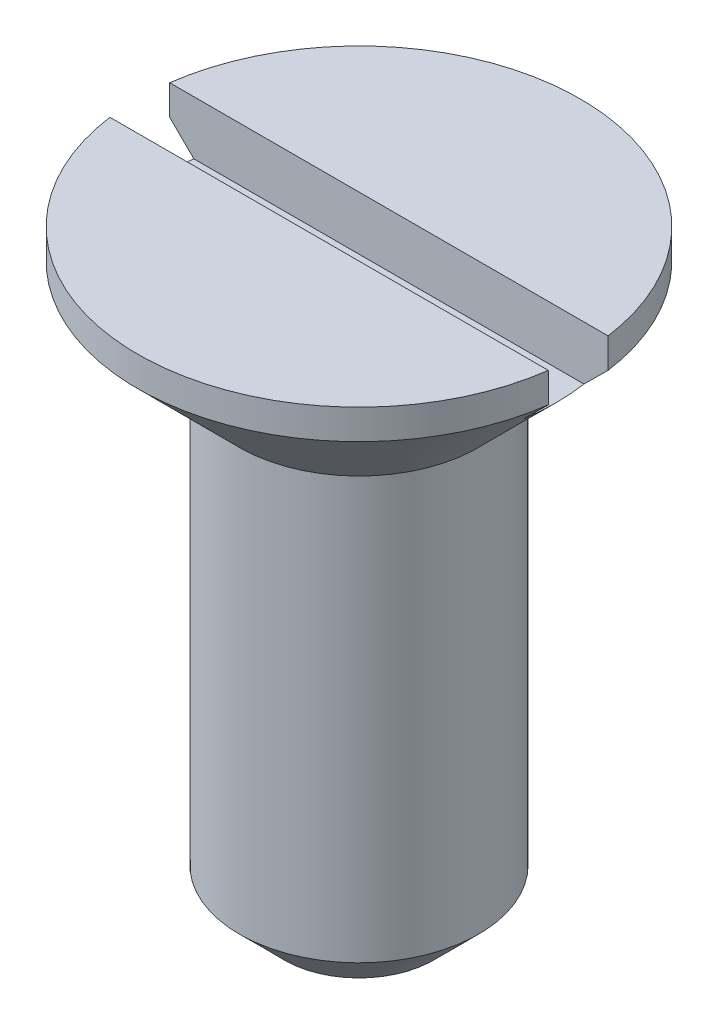
ISO-10303-21;
HEADER;
FILE_DESCRIPTION(('STEP AP214'),'2;1');
FILE_NAME('part.step','',(''),(''),'','','');
FILE_SCHEMA(('AUTOMOTIVE_DESIGN { 1 0 10303 214 1 1 1 1 }'));
ENDSEC;
DATA;
#1=APPLICATION_CONTEXT('core data for automotive mechanical design processes');
#2=APPLICATION_PROTOCOL_DEFINITION('international standard','automotive_design',2000,#1);
#3=PRODUCT_CONTEXT('',#1,'mechanical');
#4=PRODUCT('Part','Part','',(#3));
#5=PRODUCT_RELATED_PRODUCT_CATEGORY('part','',(#4));
#6=PRODUCT_DEFINITION_FORMATION('','',#4);
#7=PRODUCT_DEFINITION_CONTEXT('part definition',#1,'design');
#8=PRODUCT_DEFINITION('design','',#6,#7);
#9=PRODUCT_DEFINITION_SHAPE('','',#8);
#10=(LENGTH_UNIT() NAMED_UNIT(*) SI_UNIT(.MILLI.,.METRE.));
#11=(NAMED_UNIT(*) PLANE_ANGLE_UNIT() SI_UNIT($,.RADIAN.));
#12=(NAMED_UNIT(*) SI_UNIT($,.STERADIAN.) SOLID_ANGLE_UNIT());
#13=UNCERTAINTY_MEASURE_WITH_UNIT(LENGTH_MEASURE(1.E-05),#10,'distance_accuracy_value','');
#14=(GEOMETRIC_REPRESENTATION_CONTEXT(3) GLOBAL_UNCERTAINTY_ASSIGNED_CONTEXT((#13)) GLOBAL_UNIT_ASSIGNED_CONTEXT((#10,
#11,#12)) REPRESENTATION_CONTEXT('',''));
#15=CARTESIAN_POINT('',(0.,0.,0.));
#16=DIRECTION('',(0.,0.,1.));
#17=DIRECTION('',(1.,0.,0.));
#18=AXIS2_PLACEMENT_3D('',#15,#16,#17);
#19=CARTESIAN_POINT('',(0.,125.763182897862,0.));
#20=DIRECTION('',(0.,1.,0.));
#21=DIRECTION('',(-1.,0.,0.));
#22=AXIS2_PLACEMENT_3D('',#19,#20,#21);
#23=CYLINDRICAL_SURFACE('',#22,3.70000000000001);
#24=CARTESIAN_POINT('',(0.,91.5350422227854,0.));
#25=DIRECTION('',(0.,1.,0.));
#26=DIRECTION('',(-1.,0.,0.));
#27=AXIS2_PLACEMENT_3D('',#24,#25,#26);
#28=CIRCLE('',#27,3.70000000000001);
#29=CARTESIAN_POINT('',(3.66606055596468,91.5350422227854,-0.5));
#30=VERTEX_POINT('',#29);
#31=CARTESIAN_POINT('',(-3.66606055596469,91.5350422227854,-0.5));
#32=VERTEX_POINT('',#31);
#33=EDGE_CURVE('E103',#30,#32,#28,.T.);
#34=ORIENTED_EDGE('',*,*,#33,.T.);
#35=DIRECTION('',(0.,1.,0.));
#36=VECTOR('',#35,1.);
#37=CARTESIAN_POINT('',(-3.66606055596469,125.763182897862,-0.5));
#38=LINE('',#37,#36);
#39=CARTESIAN_POINT('',(-3.66606055596469,92.0350422227854,-0.5));
#40=VERTEX_POINT('',#39);
#41=EDGE_CURVE('E136',#32,#40,#38,.T.);
#42=ORIENTED_EDGE('',*,*,#41,.T.);
#43=CARTESIAN_POINT('',(0.,92.0350422227854,0.));
#44=DIRECTION('',(0.,1.,0.));
#45=DIRECTION('',(-1.,0.,0.));
#46=AXIS2_PLACEMENT_3D('',#43,#44,#45);
#47=CIRCLE('',#46,3.70000000000001);
#48=CARTESIAN_POINT('',(3.66606055596468,92.0350422227854,-0.5));
#49=VERTEX_POINT('',#48);
#50=EDGE_CURVE('E100',#49,#40,#47,.T.);
#51=ORIENTED_EDGE('',*,*,#50,.F.);
#52=DIRECTION('',(0.,1.,0.));
#53=VECTOR('',#52,1.);
#54=CARTESIAN_POINT('',(3.66606055596467,125.763182897862,-0.5));
#55=LINE('',#54,#53);
#56=EDGE_CURVE('E106',#49,#30,#55,.F.);
#57=ORIENTED_EDGE('',*,*,#56,.T.);
#58=EDGE_LOOP('',(#34,#42,#51,#57));
#59=FACE_BOUND('',#58,.T.);
#60=ADVANCED_FACE('F29',(#59),#23,.T.);
#61=CARTESIAN_POINT('',(0.,92.0350422227854,0.));
#62=DIRECTION('',(0.,-1.,0.));
#63=DIRECTION('',(1.,0.,0.));
#64=AXIS2_PLACEMENT_3D('',#61,#62,#63);
#65=PLANE('',#64);
#66=ORIENTED_EDGE('',*,*,#50,.T.);
#67=DIRECTION('',(1.,0.,0.));
#68=VECTOR('',#67,1.);
#69=CARTESIAN_POINT('',(0.,92.0350422227854,-0.5));
#70=LINE('',#69,#68);
#71=EDGE_CURVE('E88',#40,#49,#70,.T.);
#72=ORIENTED_EDGE('',*,*,#71,.T.);
#73=EDGE_LOOP('',(#66,#72));
#74=FACE_BOUND('',#73,.T.);
#75=ADVANCED_FACE('F162',(#74),#65,.F.);
#76=CARTESIAN_POINT('',(-3.66606055596469,91.5350422227854,0.5));
#77=VERTEX_POINT('',#76);
#78=CARTESIAN_POINT('',(3.66606055596468,91.5350422227854,0.5));
#79=VERTEX_POINT('',#78);
#80=EDGE_CURVE('E89',#77,#79,#28,.T.);
#81=ORIENTED_EDGE('',*,*,#80,.T.);
#82=DIRECTION('',(0.,1.,0.));
#83=VECTOR('',#82,1.);
#84=CARTESIAN_POINT('',(3.66606055596467,125.763182897862,0.5));
#85=LINE('',#84,#83);
#86=CARTESIAN_POINT('',(3.66606055596468,92.0350422227854,0.5));
#87=VERTEX_POINT('',#86);
#88=EDGE_CURVE('E83',#79,#87,#85,.T.);
#89=ORIENTED_EDGE('',*,*,#88,.T.);
#90=CARTESIAN_POINT('',(-3.66606055596469,92.0350422227854,0.5));
#91=VERTEX_POINT('',#90);
#92=EDGE_CURVE('E93',#91,#87,#47,.T.);
#93=ORIENTED_EDGE('',*,*,#92,.F.);
#94=DIRECTION('',(0.,1.,0.));
#95=VECTOR('',#94,1.);
#96=CARTESIAN_POINT('',(-3.66606055596469,125.763182897862,0.5));
#97=LINE('',#96,#95);
#98=EDGE_CURVE('E44',#91,#77,#97,.F.);
#99=ORIENTED_EDGE('',*,*,#98,.T.);
#100=EDGE_LOOP('',(#81,#89,#93,#99));
#101=FACE_BOUND('',#100,.T.);
#102=ADVANCED_FACE('F31',(#101),#23,.T.);
#103=CARTESIAN_POINT('',(0.,89.8350422227854,0.));
#104=DIRECTION('',(0.,1.,0.));
#105=DIRECTION('',(-1.,0.,0.));
#106=AXIS2_PLACEMENT_3D('',#103,#104,#105);
#107=CONICAL_SURFACE('',#106,2.00000000000001,0.785398163397446);
#108=ORIENTED_EDGE('',*,*,#33,.F.);
#109=CARTESIAN_POINT('',(8.13132360822901,95.9817239780611,-0.500000000000001));
#110=CARTESIAN_POINT('',(7.85454634863124,95.7054724268491,-0.500000000000001));
#111=CARTESIAN_POINT('',(7.57774623495998,95.4292437606155,-0.500000000000001));
#112=CARTESIAN_POINT('',(7.02406743196822,94.8768566169916,-0.500000000000001));
#113=CARTESIAN_POINT('',(6.74718874149741,94.6006981407543,-0.500000000000001));
#114=CARTESIAN_POINT('',(6.19323304814896,94.0483891977331,-0.500000000000001));
#115=CARTESIAN_POINT('',(5.91615600981174,93.772238766509,-0.500000000000001));
#116=CARTESIAN_POINT('',(5.36184991581115,93.2200988849353,-0.500000000000001));
#117=CARTESIAN_POINT('',(5.08462086250732,92.9441094322169,-0.500000000000001));
#118=CARTESIAN_POINT('',(4.52061085494475,92.3831212814592,-0.500000000000001));
#119=CARTESIAN_POINT('',(4.23382151474193,92.098131009829,-0.5));
#120=CARTESIAN_POINT('',(3.80327295653567,91.670999417253,-0.5));
#121=CARTESIAN_POINT('',(3.65969261270039,91.5286778273524,-0.5));
#122=CARTESIAN_POINT('',(3.37236164929214,91.2442079770921,-0.5));
#123=CARTESIAN_POINT('',(3.22861103053418,91.1020597159094,-0.5));
#124=CARTESIAN_POINT('',(2.94089221502356,90.8180463535128,-0.5));
#125=CARTESIAN_POINT('',(2.79692407273579,90.6761811971668,-0.5));
#126=CARTESIAN_POINT('',(2.50859697082639,90.3928432872926,-0.5));
#127=CARTESIAN_POINT('',(2.36423800412262,90.2513705409705,-0.5));
#128=CARTESIAN_POINT('',(2.07489502161987,89.9690877381733,-0.5));
#129=CARTESIAN_POINT('',(1.92991105888617,89.8282776274808,-0.5));
#130=CARTESIAN_POINT('',(1.71152991228014,89.6180062000606,-0.5));
#131=CARTESIAN_POINT('',(1.63858641540857,89.54807404155,-0.5));
#132=CARTESIAN_POINT('',(1.49225552040569,89.4086760741297,-0.5));
#133=CARTESIAN_POINT('',(1.41886812717503,89.3392102600894,-0.5));
#134=CARTESIAN_POINT('',(1.30548894221638,89.2329382199352,-0.5));
#135=CARTESIAN_POINT('',(1.26573789475511,89.1958752846571,-0.5));
#136=CARTESIAN_POINT('',(1.18598025457114,89.1220237091498,-0.5));
#137=CARTESIAN_POINT('',(1.14597365772385,89.0852350733686,-0.5));
#138=CARTESIAN_POINT('',(1.06574972760056,89.0121359917747,-0.5));
#139=CARTESIAN_POINT('',(1.02553341665325,88.9758244255832,-0.5));
#140=CARTESIAN_POINT('',(0.944654115413351,88.9037031423545,-0.5));
#141=CARTESIAN_POINT('',(0.90399114009078,88.8678934085893,-0.5));
#142=CARTESIAN_POINT('',(0.809857060966333,88.7864380818497,-0.5));
#143=CARTESIAN_POINT('',(0.756174827982855,88.7410360702721,-0.5));
#144=CARTESIAN_POINT('',(0.646852465862295,88.6519776527701,-0.5));
#145=CARTESIAN_POINT('',(0.591203243753726,88.6083321366081,-0.5));
#146=CARTESIAN_POINT('',(0.505199382247041,88.5455674327552,-0.5));
#147=CARTESIAN_POINT('',(0.475924684071049,88.5249802165616,-0.5));
#148=CARTESIAN_POINT('',(0.416325308472184,88.4852945286365,-0.5));
#149=CARTESIAN_POINT('',(0.385999571587397,88.4661976261457,-0.5));
#150=CARTESIAN_POINT('',(0.324234483804843,88.4304398687582,-0.5));
#151=CARTESIAN_POINT('',(0.292805756908752,88.413761049706,-0.5));
#152=CARTESIAN_POINT('',(0.228334469107967,88.3839701156319,-0.5));
#153=CARTESIAN_POINT('',(0.195296169295537,88.3708491289556,-0.5));
#154=CARTESIAN_POINT('',(0.128379987883238,88.3503133201147,-0.5));
#155=CARTESIAN_POINT('',(0.0945499146154124,88.3427519998352,-0.5));
#156=CARTESIAN_POINT('',(0.0261497215722837,88.334590240621,-0.5));
#157=CARTESIAN_POINT('',(-0.00841625664889704,88.3339578008171,-0.5));
#158=CARTESIAN_POINT('',(-0.0767915511603947,88.3397502899151,-0.5));
#159=CARTESIAN_POINT('',(-0.110602886797866,88.3461532706032,-0.5));
#160=CARTESIAN_POINT('',(-0.176829511347772,88.364420120194,-0.5));
#161=CARTESIAN_POINT('',(-0.209235227145472,88.3763164630246,-0.5));
#162=CARTESIAN_POINT('',(-0.285109373768727,88.4092225099239,-0.5));
#163=CARTESIAN_POINT('',(-0.327793651941887,88.4319734535846,-0.5));
#164=CARTESIAN_POINT('',(-0.410896275048784,88.481357888621,-0.5));
#165=CARTESIAN_POINT('',(-0.451307765946329,88.5080023343484,-0.5));
#166=CARTESIAN_POINT('',(-0.53083714262158,88.5637270883465,-0.5));
#167=CARTESIAN_POINT('',(-0.569943414150266,88.5928237774368,-0.5));
#168=CARTESIAN_POINT('',(-0.647006788255499,88.6523694846073,-0.5));
#169=CARTESIAN_POINT('',(-0.684965485099847,88.6828164664868,-0.5));
#170=CARTESIAN_POINT('',(-0.766961008422032,88.7502413568552,-0.5));
#171=CARTESIAN_POINT('',(-0.810848286372402,88.7874002946376,-0.5));
#172=CARTESIAN_POINT('',(-0.897909909413943,88.8625464117202,-0.5));
#173=CARTESIAN_POINT('',(-0.941084192421118,88.9005336624843,-0.5));
#174=CARTESIAN_POINT('',(-1.06988656891605,89.0153473756034,-0.5));
#175=CARTESIAN_POINT('',(-1.15477090401193,89.0930060983589,-0.5));
#176=CARTESIAN_POINT('',(-1.32357496350739,89.2495675069512,-0.5));
#177=CARTESIAN_POINT('',(-1.40749332683433,89.3284716465734,-0.5));
#178=CARTESIAN_POINT('',(-1.57465735903855,89.4869621773338,-0.5));
#179=CARTESIAN_POINT('',(-1.65790313405632,89.5665484565711,-0.5));
#180=CARTESIAN_POINT('',(-1.82339938024086,89.7256164850114,-0.5));
#181=CARTESIAN_POINT('',(-1.90565276262282,89.8050952123578,-0.5));
#182=CARTESIAN_POINT('',(-2.06987261927147,89.9643552893433,-0.5));
#183=CARTESIAN_POINT('',(-2.15183908128908,90.0441366516066,-0.5));
#184=CARTESIAN_POINT('',(-2.39732857628746,90.2836933472258,-0.5));
#185=CARTESIAN_POINT('',(-2.56054581908466,90.4437818412804,-0.5));
#186=CARTESIAN_POINT('',(-2.94883478293584,90.8256912520063,-0.5));
#187=CARTESIAN_POINT('',(-3.17370281393132,91.047718946503,-0.5));
#188=CARTESIAN_POINT('',(-3.62299042028746,91.492230047965,-0.5));
#189=CARTESIAN_POINT('',(-3.84740999282743,91.7147134577788,-0.5));
#190=CARTESIAN_POINT('',(-4.52040153942629,92.3826748828142,-0.5));
#191=CARTESIAN_POINT('',(-4.96858498353853,92.8285442006634,-0.499999999999999));
#192=CARTESIAN_POINT('',(-5.86939641990889,93.7255580038718,-0.499999999999999));
#193=CARTESIAN_POINT('',(-6.32201976844675,94.1767071477719,-0.499999999999999));
#194=CARTESIAN_POINT('',(-7.22688257957794,95.079132878405,-0.499999999999999));
#195=CARTESIAN_POINT('',(-7.67912211475732,95.5304093923461,-0.499999999999999));
#196=CARTESIAN_POINT('',(-8.13132360822902,95.9817239780611,-0.499999999999999));
#197=B_SPLINE_CURVE_WITH_KNOTS('',3,(#109,#110,#111,#112,#113,#114,#115,#116,#117,#118,#119,
#120,#121,#122,#123,#124,#125,#126,#127,#128,#129,#130,#131,#132,#133,#134,#135,#136,#137,#138,
#139,#140,#141,#142,#143,#144,#145,#146,#147,#148,#149,#150,#151,#152,#153,#154,#155,#156,#157,
#158,#159,#160,#161,#162,#163,#164,#165,#166,#167,#168,#169,#170,#171,#172,#173,#174,#175,#176,
#177,#178,#179,#180,#181,#182,#183,#184,#185,#186,#187,#188,#189,#190,#191,#192,#193,#194,#195,
#196),.UNSPECIFIED.,.F.,.F.,(4,2,2,2,2,2,2,2,2,2,2,2,2,2,2,2,2,2,2,2,2,2,2,2,2,2,2,2,2,2,2,2,2,
2,2,2,2,2,2,2,2,2,2,4),(0.,1.17315180831129,2.34632178168895,3.5198960658454,4.6934526224815,
5.90638597142389,6.51288133208739,7.11937380140662,7.72573361994932,8.33210450089825,
8.93842487395491,9.24157609158454,9.54472396849325,9.70776985689124,9.87081838354587,
10.0333669553185,10.1959100957745,10.4068149816035,10.6188719019793,10.7262080623993,
10.8336557598619,10.9402590884403,11.046594098727,11.1500155314531,11.2529591122958,
11.355582452286,11.4588203716541,11.6035218276883,11.7486385320468,11.8948159288606,
12.0407799292645,12.2132796273431,12.3857942674568,12.730915017809,13.0764738103991,
13.421976961633,13.7651121899113,14.1082618927499,14.7941271056863,15.742154123613,
16.6901870857306,18.5867647903142,20.5039582917546,22.4206062613089),.UNSPECIFIED.);
#198=CARTESIAN_POINT('',(3.26190128606001,91.1350422227854,-0.5));
#199=VERTEX_POINT('',#198);
#200=EDGE_CURVE('E52',#30,#199,#197,.T.);
#201=ORIENTED_EDGE('',*,*,#200,.T.);
#202=CARTESIAN_POINT('',(0.,91.1350422227854,0.));
#203=DIRECTION('',(0.,1.,0.));
#204=DIRECTION('',(0.,0.,1.));
#205=AXIS2_PLACEMENT_3D('',#202,#203,#204);
#206=CIRCLE('',#205,3.3);
#207=CARTESIAN_POINT('',(3.26190128606001,91.1350422227854,0.5));
#208=VERTEX_POINT('',#207);
#209=EDGE_CURVE('E115',#208,#199,#206,.T.);
#210=ORIENTED_EDGE('',*,*,#209,.F.);
#211=CARTESIAN_POINT('',(-8.13132360822902,95.9817239780611,0.500000000000001));
#212=CARTESIAN_POINT('',(-7.85454634863125,95.7054724268491,0.500000000000001));
#213=CARTESIAN_POINT('',(-7.57774623496,95.4292437606155,0.500000000000001));
#214=CARTESIAN_POINT('',(-7.02406743196824,94.8768566169916,0.500000000000001));
#215=CARTESIAN_POINT('',(-6.74718874149743,94.6006981407543,0.500000000000001));
#216=CARTESIAN_POINT('',(-6.19323304814898,94.0483891977331,0.500000000000001));
#217=CARTESIAN_POINT('',(-5.91615600981175,93.772238766509,0.500000000000001));
#218=CARTESIAN_POINT('',(-5.36184991581116,93.2200988849353,0.500000000000001));
#219=CARTESIAN_POINT('',(-5.08462086250734,92.9441094322169,0.500000000000001));
#220=CARTESIAN_POINT('',(-4.52061085494476,92.3831212814592,0.500000000000001));
#221=CARTESIAN_POINT('',(-4.23382151474195,92.098131009829,0.5));
#222=CARTESIAN_POINT('',(-3.8032729565357,91.670999417253,0.5));
#223=CARTESIAN_POINT('',(-3.65969261270042,91.5286778273524,0.5));
#224=CARTESIAN_POINT('',(-3.37236164929216,91.2442079770921,0.5));
#225=CARTESIAN_POINT('',(-3.22861103053419,91.1020597159094,0.5));
#226=CARTESIAN_POINT('',(-2.94089221502357,90.8180463535128,0.5));
#227=CARTESIAN_POINT('',(-2.7969240727358,90.6761811971668,0.5));
#228=CARTESIAN_POINT('',(-2.5085969708264,90.3928432872926,0.5));
#229=CARTESIAN_POINT('',(-2.36423800412264,90.2513705409705,0.5));
#230=CARTESIAN_POINT('',(-2.07489502161989,89.9690877381733,0.5));
#231=CARTESIAN_POINT('',(-1.92991105888619,89.8282776274808,0.5));
#232=CARTESIAN_POINT('',(-1.71152991228016,89.6180062000606,0.5));
#233=CARTESIAN_POINT('',(-1.63858641540858,89.54807404155,0.5));
#234=CARTESIAN_POINT('',(-1.49225552040571,89.4086760741297,0.5));
#235=CARTESIAN_POINT('',(-1.41886812717505,89.3392102600894,0.5));
#236=CARTESIAN_POINT('',(-1.30548894221639,89.2329382199352,0.5));
#237=CARTESIAN_POINT('',(-1.26573789475512,89.1958752846571,0.5));
#238=CARTESIAN_POINT('',(-1.18598025457115,89.1220237091498,0.5));
#239=CARTESIAN_POINT('',(-1.14597365772386,89.0852350733686,0.5));
#240=CARTESIAN_POINT('',(-1.06574972760058,89.0121359917747,0.5));
#241=CARTESIAN_POINT('',(-1.02553341665327,88.9758244255832,0.5));
#242=CARTESIAN_POINT('',(-0.944654115413364,88.9037031423545,0.5));
#243=CARTESIAN_POINT('',(-0.903991140090793,88.8678934085893,0.5));
#244=CARTESIAN_POINT('',(-0.809857060966346,88.7864380818497,0.5));
#245=CARTESIAN_POINT('',(-0.756174827982868,88.7410360702721,0.5));
#246=CARTESIAN_POINT('',(-0.646852465862308,88.6519776527701,0.5));
#247=CARTESIAN_POINT('',(-0.591203243753737,88.6083321366081,0.5));
#248=CARTESIAN_POINT('',(-0.505199382247051,88.5455674327552,0.5));
#249=CARTESIAN_POINT('',(-0.475924684071055,88.5249802165615,0.5));
#250=CARTESIAN_POINT('',(-0.416325308472191,88.4852945286365,0.5));
#251=CARTESIAN_POINT('',(-0.385999571587408,88.4661976261457,0.5));
#252=CARTESIAN_POINT('',(-0.324234483804857,88.4304398687582,0.5));
#253=CARTESIAN_POINT('',(-0.292805756908764,88.4137610497061,0.5));
#254=CARTESIAN_POINT('',(-0.228334469107978,88.3839701156319,0.5));
#255=CARTESIAN_POINT('',(-0.195296169295549,88.3708491289556,0.5));
#256=CARTESIAN_POINT('',(-0.128379987883251,88.3503133201147,0.5));
#257=CARTESIAN_POINT('',(-0.0945499146154255,88.3427519998352,0.5));
#258=CARTESIAN_POINT('',(-0.0261497215722968,88.334590240621,0.5));
#259=CARTESIAN_POINT('',(0.0084162566488839,88.3339578008171,0.5));
#260=CARTESIAN_POINT('',(0.0767915511603821,88.3397502899151,0.5));
#261=CARTESIAN_POINT('',(0.110602886797854,88.3461532706032,0.5));
#262=CARTESIAN_POINT('',(0.176829511347759,88.364420120194,0.5));
#263=CARTESIAN_POINT('',(0.209235227145459,88.3763164630246,0.5));
#264=CARTESIAN_POINT('',(0.285109373768714,88.4092225099239,0.5));
#265=CARTESIAN_POINT('',(0.327793651941873,88.4319734535846,0.5));
#266=CARTESIAN_POINT('',(0.410896275048767,88.481357888621,0.5));
#267=CARTESIAN_POINT('',(0.45130776594631,88.5080023343484,0.5));
#268=CARTESIAN_POINT('',(0.530837142621561,88.5637270883465,0.5));
#269=CARTESIAN_POINT('',(0.56994341415025,88.5928237774368,0.5));
#270=CARTESIAN_POINT('',(0.647006788255484,88.6523694846073,0.5));
#271=CARTESIAN_POINT('',(0.684965485099832,88.6828164664868,0.5));
#272=CARTESIAN_POINT('',(0.766961008422016,88.7502413568552,0.5));
#273=CARTESIAN_POINT('',(0.810848286372386,88.7874002946376,0.5));
#274=CARTESIAN_POINT('',(0.897909909413928,88.8625464117202,0.5));
#275=CARTESIAN_POINT('',(0.941084192421102,88.9005336624843,0.5));
#276=CARTESIAN_POINT('',(1.06988656891603,89.0153473756034,0.5));
#277=CARTESIAN_POINT('',(1.15477090401191,89.0930060983589,0.5));
#278=CARTESIAN_POINT('',(1.32357496350737,89.2495675069512,0.5));
#279=CARTESIAN_POINT('',(1.40749332683431,89.3284716465734,0.5));
#280=CARTESIAN_POINT('',(1.57465735903853,89.4869621773338,0.5));
#281=CARTESIAN_POINT('',(1.65790313405631,89.5665484565711,0.5));
#282=CARTESIAN_POINT('',(1.82339938024085,89.7256164850114,0.5));
#283=CARTESIAN_POINT('',(1.90565276262282,89.8050952123578,0.5));
#284=CARTESIAN_POINT('',(2.06987261927147,89.9643552893433,0.5));
#285=CARTESIAN_POINT('',(2.15183908128907,90.0441366516066,0.5));
#286=CARTESIAN_POINT('',(2.39732857628744,90.2836933472258,0.5));
#287=CARTESIAN_POINT('',(2.56054581908464,90.4437818412804,0.5));
#288=CARTESIAN_POINT('',(2.94883478293583,90.8256912520063,0.5));
#289=CARTESIAN_POINT('',(3.17370281393131,91.047718946503,0.5));
#290=CARTESIAN_POINT('',(3.62299042028745,91.492230047965,0.5));
#291=CARTESIAN_POINT('',(3.84740999282741,91.7147134577788,0.5));
#292=CARTESIAN_POINT('',(4.52040153942627,92.3826748828142,0.5));
#293=CARTESIAN_POINT('',(4.96858498353853,92.8285442006634,0.499999999999999));
#294=CARTESIAN_POINT('',(5.86939641990888,93.7255580038718,0.499999999999999));
#295=CARTESIAN_POINT('',(6.32201976844674,94.1767071477719,0.499999999999999));
#296=CARTESIAN_POINT('',(7.22688257957792,95.079132878405,0.499999999999999));
#297=CARTESIAN_POINT('',(7.6791221147573,95.5304093923461,0.499999999999999));
#298=CARTESIAN_POINT('',(8.131323608229,95.9817239780611,0.499999999999999));
#299=B_SPLINE_CURVE_WITH_KNOTS('',3,(#211,#212,#213,#214,#215,#216,#217,#218,#219,#220,#221,
#222,#223,#224,#225,#226,#227,#228,#229,#230,#231,#232,#233,#234,#235,#236,#237,#238,#239,#240,
#241,#242,#243,#244,#245,#246,#247,#248,#249,#250,#251,#252,#253,#254,#255,#256,#257,#258,#259,
#260,#261,#262,#263,#264,#265,#266,#267,#268,#269,#270,#271,#272,#273,#274,#275,#276,#277,#278,
#279,#280,#281,#282,#283,#284,#285,#286,#287,#288,#289,#290,#291,#292,#293,#294,#295,#296,#297,
#298),.UNSPECIFIED.,.F.,.F.,(4,2,2,2,2,2,2,2,2,2,2,2,2,2,2,2,2,2,2,2,2,2,2,2,2,2,2,2,2,2,2,2,2,
2,2,2,2,2,2,2,2,2,2,4),(0.,1.17315180831129,2.34632178168895,3.5198960658454,4.6934526224815,
5.90638597142388,6.51288133208739,7.11937380140663,7.72573361994932,8.33210450089825,
8.93842487395492,9.24157609158455,9.54472396849325,9.70776985689124,9.87081838354587,
10.0333669553185,10.1959100957745,10.4068149816035,10.6188719019793,10.7262080623993,
10.8336557598619,10.9402590884403,11.046594098727,11.1500155314532,11.2529591122958,
11.355582452286,11.4588203716541,11.6035218276883,11.7486385320468,11.8948159288606,
12.0407799292645,12.2132796273431,12.3857942674568,12.7309150178089,13.0764738103991,
13.421976961633,13.7651121899113,14.1082618927499,14.7941271056863,15.742154123613,
16.6901870857306,18.5867647903142,20.5039582917546,22.4206062613089),.UNSPECIFIED.);
#300=EDGE_CURVE('E96',#208,#79,#299,.T.);
#301=ORIENTED_EDGE('',*,*,#300,.T.);
#302=ORIENTED_EDGE('',*,*,#80,.F.);
#303=CARTESIAN_POINT('',(-3.26190128606003,91.1350422227854,0.5));
#304=VERTEX_POINT('',#303);
#305=EDGE_CURVE('E95',#77,#304,#299,.T.);
#306=ORIENTED_EDGE('',*,*,#305,.T.);
#307=CARTESIAN_POINT('',(-3.26190128606003,91.1350422227854,-0.5));
#308=VERTEX_POINT('',#307);
#309=EDGE_CURVE('E114',#308,#304,#206,.T.);
#310=ORIENTED_EDGE('',*,*,#309,.F.);
#311=EDGE_CURVE('E131',#308,#32,#197,.T.);
#312=ORIENTED_EDGE('',*,*,#311,.T.);
#313=EDGE_LOOP('',(#108,#201,#210,#301,#302,#306,#310,#312));
#314=FACE_BOUND('',#313,.T.);
#315=CARTESIAN_POINT('',(0.,89.8350422227854,0.));
#316=DIRECTION('',(0.,1.,0.));
#317=DIRECTION('',(-1.,0.,0.));
#318=AXIS2_PLACEMENT_3D('',#315,#316,#317);
#319=CIRCLE('',#318,2.00000000000001);
#320=CARTESIAN_POINT('',(-2.00000000000002,89.8350422227854,0.));
#321=VERTEX_POINT('',#320);
#322=EDGE_CURVE('E99',#321,#321,#319,.T.);
#323=ORIENTED_EDGE('',*,*,#322,.T.);
#324=EDGE_LOOP('',(#323));
#325=FACE_BOUND('',#324,.T.);
#326=ADVANCED_FACE('F134',(#314,#325),#107,.T.);
#327=CARTESIAN_POINT('',(0.,125.763182897862,0.));
#328=DIRECTION('',(0.,1.,0.));
#329=DIRECTION('',(-1.,0.,0.));
#330=AXIS2_PLACEMENT_3D('',#327,#328,#329);
#331=CYLINDRICAL_SURFACE('',#330,2.00000000000001);
#332=CARTESIAN_POINT('',(0.,82.7850422227854,0.));
#333=DIRECTION('',(0.,1.,0.));
#334=DIRECTION('',(-1.,0.,0.));
#335=AXIS2_PLACEMENT_3D('',#332,#333,#334);
#336=CIRCLE('',#335,2.00000000000001);
#337=CARTESIAN_POINT('',(-2.00000000000002,82.7850422227854,0.));
#338=VERTEX_POINT('',#337);
#339=EDGE_CURVE('E37',#338,#338,#336,.T.);
#340=ORIENTED_EDGE('',*,*,#339,.T.);
#341=EDGE_LOOP('',(#340));
#342=FACE_BOUND('',#341,.T.);
#343=ORIENTED_EDGE('',*,*,#322,.F.);
#344=EDGE_LOOP('',(#343));
#345=FACE_BOUND('',#344,.T.);
#346=ADVANCED_FACE('F164',(#342,#345),#331,.T.);
#347=CARTESIAN_POINT('',(2.00000000000001,82.0350422227854,0.));
#348=DIRECTION('',(0.,1.,0.));
#349=DIRECTION('',(-1.,0.,0.));
#350=AXIS2_PLACEMENT_3D('',#347,#348,#349);
#351=PLANE('',#350);
#352=CARTESIAN_POINT('',(0.,82.0350422227854,0.));
#353=DIRECTION('',(0.,1.,0.));
#354=DIRECTION('',(-1.,0.,0.));
#355=AXIS2_PLACEMENT_3D('',#352,#353,#354);
#356=CIRCLE('',#355,1.25000000000001);
#357=CARTESIAN_POINT('',(-1.25000000000002,82.0350422227854,0.));
#358=VERTEX_POINT('',#357);
#359=EDGE_CURVE('E11',#358,#358,#356,.F.);
#360=ORIENTED_EDGE('',*,*,#359,.T.);
#361=EDGE_LOOP('',(#360));
#362=FACE_BOUND('',#361,.T.);
#363=ADVANCED_FACE('F161',(#362),#351,.F.);
#364=ORIENTED_EDGE('',*,*,#92,.T.);
#365=DIRECTION('',(-1.,0.,0.));
#366=VECTOR('',#365,1.);
#367=CARTESIAN_POINT('',(0.,92.0350422227854,0.5));
#368=LINE('',#367,#366);
#369=EDGE_CURVE('E80',#87,#91,#368,.T.);
#370=ORIENTED_EDGE('',*,*,#369,.T.);
#371=EDGE_LOOP('',(#364,#370));
#372=FACE_BOUND('',#371,.T.);
#373=ADVANCED_FACE('F98',(#372),#65,.F.);
#374=CARTESIAN_POINT('',(-3.70000000000001,91.1350422227854,0.5));
#375=DIRECTION('',(0.,1.,0.));
#376=DIRECTION('',(0.,0.,1.));
#377=AXIS2_PLACEMENT_3D('',#374,#375,#376);
#378=PLANE('',#377);
#379=ORIENTED_EDGE('',*,*,#209,.T.);
#380=DIRECTION('',(-1.,0.,0.));
#381=VECTOR('',#380,1.);
#382=CARTESIAN_POINT('',(-3.70000000000001,91.1350422227854,-0.5));
#383=LINE('',#382,#381);
#384=EDGE_CURVE('E124',#199,#308,#383,.T.);
#385=ORIENTED_EDGE('',*,*,#384,.T.);
#386=ORIENTED_EDGE('',*,*,#309,.T.);
#387=DIRECTION('',(1.,0.,0.));
#388=VECTOR('',#387,1.);
#389=CARTESIAN_POINT('',(-3.70000000000001,91.1350422227854,0.5));
#390=LINE('',#389,#388);
#391=EDGE_CURVE('E127',#304,#208,#390,.T.);
#392=ORIENTED_EDGE('',*,*,#391,.T.);
#393=EDGE_LOOP('',(#379,#385,#386,#392));
#394=FACE_BOUND('',#393,.T.);
#395=ADVANCED_FACE('F123',(#394),#378,.T.);
#396=CARTESIAN_POINT('',(-3.70000000000001,91.1350422227854,-0.5));
#397=DIRECTION('',(0.,0.,-1.));
#398=DIRECTION('',(-1.,0.,0.));
#399=AXIS2_PLACEMENT_3D('',#396,#397,#398);
#400=PLANE('',#399);
#401=ORIENTED_EDGE('',*,*,#71,.F.);
#402=ORIENTED_EDGE('',*,*,#41,.F.);
#403=ORIENTED_EDGE('',*,*,#311,.F.);
#404=ORIENTED_EDGE('',*,*,#384,.F.);
#405=ORIENTED_EDGE('',*,*,#200,.F.);
#406=ORIENTED_EDGE('',*,*,#56,.F.);
#407=EDGE_LOOP('',(#401,#402,#403,#404,#405,#406));
#408=FACE_BOUND('',#407,.T.);
#409=ADVANCED_FACE('F129',(#408),#400,.F.);
#410=CARTESIAN_POINT('',(-3.70000000000001,91.1350422227854,0.5));
#411=DIRECTION('',(0.,0.,1.));
#412=DIRECTION('',(1.,0.,0.));
#413=AXIS2_PLACEMENT_3D('',#410,#411,#412);
#414=PLANE('',#413);
#415=ORIENTED_EDGE('',*,*,#369,.F.);
#416=ORIENTED_EDGE('',*,*,#88,.F.);
#417=ORIENTED_EDGE('',*,*,#300,.F.);
#418=ORIENTED_EDGE('',*,*,#391,.F.);
#419=ORIENTED_EDGE('',*,*,#305,.F.);
#420=ORIENTED_EDGE('',*,*,#98,.F.);
#421=EDGE_LOOP('',(#415,#416,#417,#418,#419,#420));
#422=FACE_BOUND('',#421,.T.);
#423=ADVANCED_FACE('F82',(#422),#414,.F.);
#424=CARTESIAN_POINT('',(0.,82.7850422227854,0.));
#425=DIRECTION('',(0.,1.,0.));
#426=DIRECTION('',(-1.,0.,0.));
#427=AXIS2_PLACEMENT_3D('',#424,#425,#426);
#428=CONICAL_SURFACE('',#427,2.00000000000001,0.785398163397447);
#429=ORIENTED_EDGE('',*,*,#359,.F.);
#430=EDGE_LOOP('',(#429));
#431=FACE_BOUND('',#430,.T.);
#432=ORIENTED_EDGE('',*,*,#339,.F.);
#433=EDGE_LOOP('',(#432));
#434=FACE_BOUND('',#433,.T.);
#435=ADVANCED_FACE('F156',(#431,#434),#428,.T.);
#436=CLOSED_SHELL('',(#60,#75,#102,#326,#346,#363,#373,#395,#409,#423,#435));
#437=MANIFOLD_SOLID_BREP('B2',#436);
#438=ADVANCED_BREP_SHAPE_REPRESENTATION('',(#18,#437),#14);
#439=SHAPE_DEFINITION_REPRESENTATION(#9,#438);
ENDSEC;
END-ISO-10303-21;
